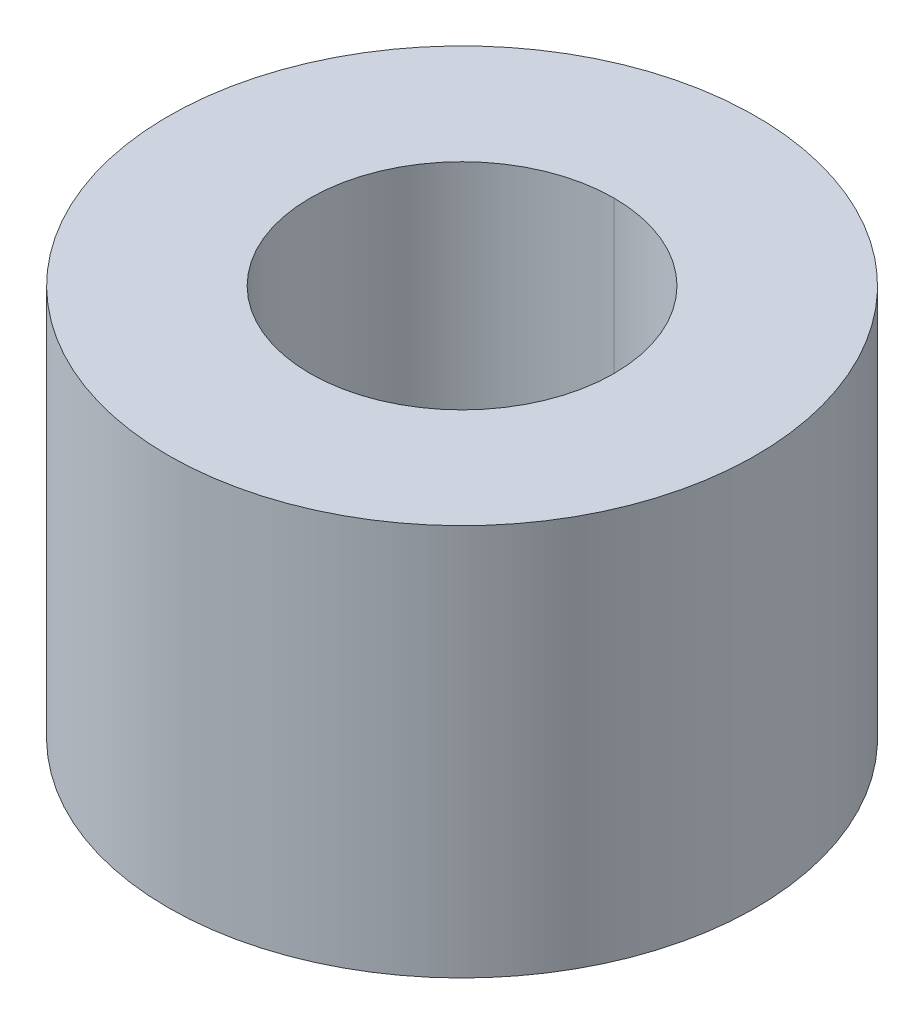
ISO-10303-21;
HEADER;
FILE_DESCRIPTION(('STEP AP214'),'2;1');
FILE_NAME('part.step','',(''),(''),'','','');
FILE_SCHEMA(('AUTOMOTIVE_DESIGN { 1 0 10303 214 1 1 1 1 }'));
ENDSEC;
DATA;
#1=APPLICATION_CONTEXT('core data for automotive mechanical design processes');
#2=APPLICATION_PROTOCOL_DEFINITION('international standard','automotive_design',2000,#1);
#3=PRODUCT_CONTEXT('',#1,'mechanical');
#4=PRODUCT('Part','Part','',(#3));
#5=PRODUCT_RELATED_PRODUCT_CATEGORY('part','',(#4));
#6=PRODUCT_DEFINITION_FORMATION('','',#4);
#7=PRODUCT_DEFINITION_CONTEXT('part definition',#1,'design');
#8=PRODUCT_DEFINITION('design','',#6,#7);
#9=PRODUCT_DEFINITION_SHAPE('','',#8);
#10=(LENGTH_UNIT() NAMED_UNIT(*) SI_UNIT(.MILLI.,.METRE.));
#11=(NAMED_UNIT(*) PLANE_ANGLE_UNIT() SI_UNIT($,.RADIAN.));
#12=(NAMED_UNIT(*) SI_UNIT($,.STERADIAN.) SOLID_ANGLE_UNIT());
#13=UNCERTAINTY_MEASURE_WITH_UNIT(LENGTH_MEASURE(1.E-05),#10,'distance_accuracy_value','');
#14=(GEOMETRIC_REPRESENTATION_CONTEXT(3) GLOBAL_UNCERTAINTY_ASSIGNED_CONTEXT((#13)) GLOBAL_UNIT_ASSIGNED_CONTEXT((#10,
#11,#12)) REPRESENTATION_CONTEXT('',''));
#15=CARTESIAN_POINT('',(0.,0.,0.));
#16=DIRECTION('',(0.,0.,1.));
#17=DIRECTION('',(1.,0.,0.));
#18=AXIS2_PLACEMENT_3D('',#15,#16,#17);
#19=CARTESIAN_POINT('',(0.,-3.175,0.));
#20=DIRECTION('',(0.,1.,0.));
#21=DIRECTION('',(1.,0.,0.));
#22=AXIS2_PLACEMENT_3D('',#19,#20,#21);
#23=PLANE('',#22);
#24=CARTESIAN_POINT('',(0.,-3.175,0.));
#25=DIRECTION('',(0.,1.,0.));
#26=DIRECTION('',(0.,0.,1.));
#27=AXIS2_PLACEMENT_3D('',#24,#25,#26);
#28=CIRCLE('',#27,2.4638);
#29=CARTESIAN_POINT('',(0.,-3.175,-2.4638));
#30=VERTEX_POINT('',#29);
#31=CARTESIAN_POINT('',(0.,-3.175,2.4638));
#32=VERTEX_POINT('',#31);
#33=EDGE_CURVE('E11',#30,#32,#28,.T.);
#34=ORIENTED_EDGE('',*,*,#33,.T.);
#35=CARTESIAN_POINT('',(0.,-3.175,0.));
#36=DIRECTION('',(0.,1.,0.));
#37=DIRECTION('',(0.,0.,1.));
#38=AXIS2_PLACEMENT_3D('',#35,#36,#37);
#39=CIRCLE('',#38,2.4638);
#40=EDGE_CURVE('E46',#32,#30,#39,.T.);
#41=ORIENTED_EDGE('',*,*,#40,.T.);
#42=EDGE_LOOP('',(#34,#41));
#43=FACE_BOUND('',#42,.T.);
#44=CARTESIAN_POINT('',(0.,-3.175,0.));
#45=DIRECTION('',(0.,1.,0.));
#46=DIRECTION('',(0.,0.,1.));
#47=AXIS2_PLACEMENT_3D('',#44,#45,#46);
#48=CIRCLE('',#47,4.7625);
#49=CARTESIAN_POINT('',(0.,-3.175,4.7625));
#50=VERTEX_POINT('',#49);
#51=EDGE_CURVE('E91',#50,#50,#48,.T.);
#52=ORIENTED_EDGE('',*,*,#51,.F.);
#53=EDGE_LOOP('',(#52));
#54=FACE_BOUND('',#53,.T.);
#55=ADVANCED_FACE('F42',(#43,#54),#23,.F.);
#56=CARTESIAN_POINT('',(0.,3.175,0.));
#57=DIRECTION('',(0.,1.,0.));
#58=DIRECTION('',(1.,0.,0.));
#59=AXIS2_PLACEMENT_3D('',#56,#57,#58);
#60=PLANE('',#59);
#61=CARTESIAN_POINT('',(0.,3.175,0.));
#62=DIRECTION('',(0.,1.,0.));
#63=DIRECTION('',(0.,0.,1.));
#64=AXIS2_PLACEMENT_3D('',#61,#62,#63);
#65=CIRCLE('',#64,2.4638);
#66=CARTESIAN_POINT('',(0.,3.175,-2.4638));
#67=VERTEX_POINT('',#66);
#68=CARTESIAN_POINT('',(0.,3.175,2.4638));
#69=VERTEX_POINT('',#68);
#70=EDGE_CURVE('E75',#67,#69,#65,.T.);
#71=ORIENTED_EDGE('',*,*,#70,.F.);
#72=CARTESIAN_POINT('',(0.,3.175,0.));
#73=DIRECTION('',(0.,1.,0.));
#74=DIRECTION('',(0.,0.,1.));
#75=AXIS2_PLACEMENT_3D('',#72,#73,#74);
#76=CIRCLE('',#75,2.4638);
#77=EDGE_CURVE('E84',#69,#67,#76,.T.);
#78=ORIENTED_EDGE('',*,*,#77,.F.);
#79=EDGE_LOOP('',(#71,#78));
#80=FACE_BOUND('',#79,.T.);
#81=CARTESIAN_POINT('',(0.,3.175,0.));
#82=DIRECTION('',(0.,1.,0.));
#83=DIRECTION('',(0.,0.,1.));
#84=AXIS2_PLACEMENT_3D('',#81,#82,#83);
#85=CIRCLE('',#84,4.7625);
#86=CARTESIAN_POINT('',(0.,3.175,4.7625));
#87=VERTEX_POINT('',#86);
#88=EDGE_CURVE('E95',#87,#87,#85,.T.);
#89=ORIENTED_EDGE('',*,*,#88,.T.);
#90=EDGE_LOOP('',(#89));
#91=FACE_BOUND('',#90,.T.);
#92=ADVANCED_FACE('F85',(#80,#91),#60,.T.);
#93=CARTESIAN_POINT('',(0.,3.175,0.));
#94=DIRECTION('',(0.,-1.,0.));
#95=DIRECTION('',(0.,0.,-1.));
#96=AXIS2_PLACEMENT_3D('',#93,#94,#95);
#97=CYLINDRICAL_SURFACE('',#96,2.4638);
#98=DIRECTION('',(0.,-1.,0.));
#99=VECTOR('',#98,1.);
#100=CARTESIAN_POINT('',(0.,3.175,2.4638));
#101=LINE('',#100,#99);
#102=EDGE_CURVE('E78',#69,#32,#101,.T.);
#103=ORIENTED_EDGE('',*,*,#102,.F.);
#104=ORIENTED_EDGE('',*,*,#77,.T.);
#105=DIRECTION('',(0.,-1.,0.));
#106=VECTOR('',#105,1.);
#107=CARTESIAN_POINT('',(0.,3.175,-2.4638));
#108=LINE('',#107,#106);
#109=EDGE_CURVE('E79',#67,#30,#108,.T.);
#110=ORIENTED_EDGE('',*,*,#109,.T.);
#111=ORIENTED_EDGE('',*,*,#40,.F.);
#112=EDGE_LOOP('',(#103,#104,#110,#111));
#113=FACE_BOUND('',#112,.T.);
#114=ADVANCED_FACE('F89',(#113),#97,.F.);
#115=CARTESIAN_POINT('',(0.,3.175,0.));
#116=DIRECTION('',(0.,-1.,0.));
#117=DIRECTION('',(0.,0.,-1.));
#118=AXIS2_PLACEMENT_3D('',#115,#116,#117);
#119=CYLINDRICAL_SURFACE('',#118,2.4638);
#120=ORIENTED_EDGE('',*,*,#70,.T.);
#121=ORIENTED_EDGE('',*,*,#102,.T.);
#122=ORIENTED_EDGE('',*,*,#33,.F.);
#123=ORIENTED_EDGE('',*,*,#109,.F.);
#124=EDGE_LOOP('',(#120,#121,#122,#123));
#125=FACE_BOUND('',#124,.T.);
#126=ADVANCED_FACE('F44',(#125),#119,.F.);
#127=CARTESIAN_POINT('',(0.,-3.175,0.));
#128=DIRECTION('',(0.,1.,0.));
#129=DIRECTION('',(0.,0.,1.));
#130=AXIS2_PLACEMENT_3D('',#127,#128,#129);
#131=CYLINDRICAL_SURFACE('',#130,4.7625);
#132=ORIENTED_EDGE('',*,*,#51,.T.);
#133=EDGE_LOOP('',(#132));
#134=FACE_BOUND('',#133,.T.);
#135=ORIENTED_EDGE('',*,*,#88,.F.);
#136=EDGE_LOOP('',(#135));
#137=FACE_BOUND('',#136,.T.);
#138=ADVANCED_FACE('F103',(#134,#137),#131,.T.);
#139=CLOSED_SHELL('',(#55,#92,#114,#126,#138));
#140=MANIFOLD_SOLID_BREP('B2',#139);
#141=ADVANCED_BREP_SHAPE_REPRESENTATION('',(#18,#140),#14);
#142=SHAPE_DEFINITION_REPRESENTATION(#9,#141);
ENDSEC;
END-ISO-10303-21;
